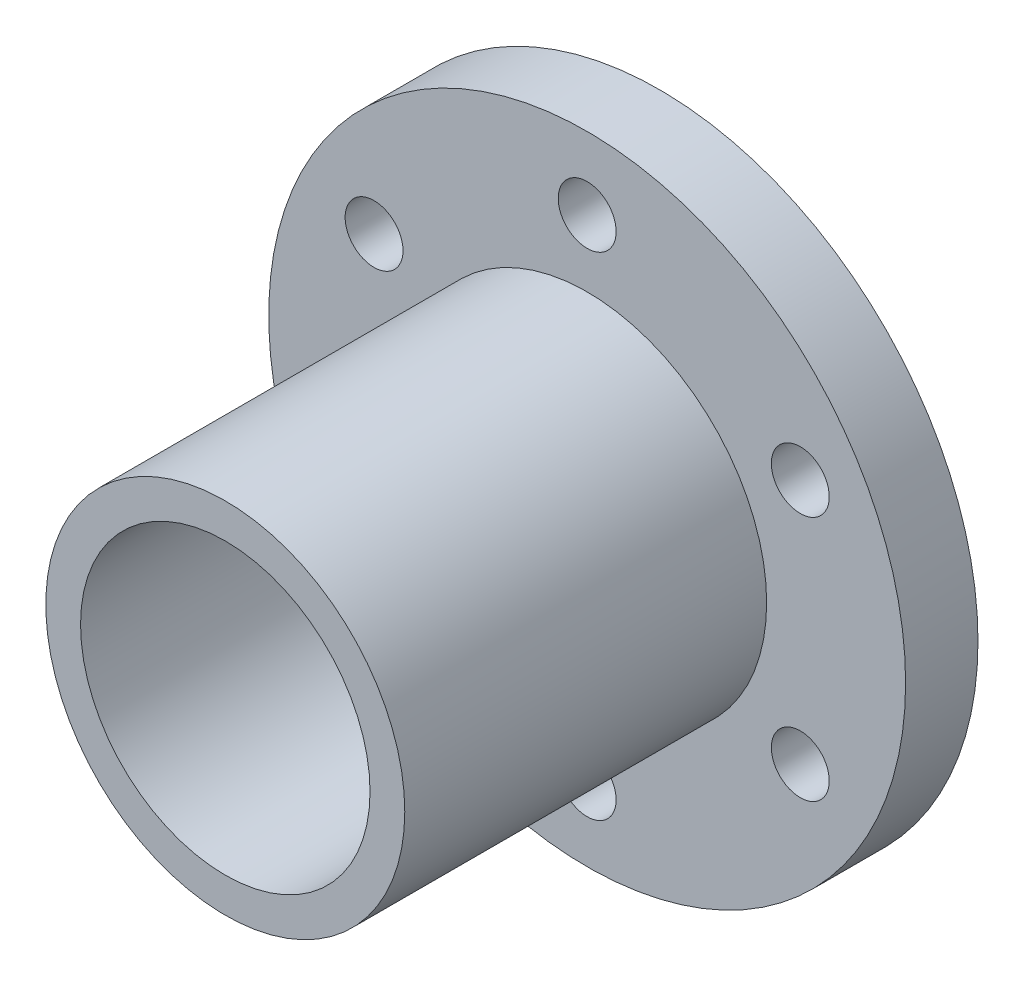
ISO-10303-21;
HEADER;
FILE_DESCRIPTION(('STEP AP214'),'2;1');
FILE_NAME('part.step','',(''),(''),'','','');
FILE_SCHEMA(('AUTOMOTIVE_DESIGN { 1 0 10303 214 1 1 1 1 }'));
ENDSEC;
DATA;
#1=APPLICATION_CONTEXT('core data for automotive mechanical design processes');
#2=APPLICATION_PROTOCOL_DEFINITION('international standard','automotive_design',2000,#1);
#3=PRODUCT_CONTEXT('',#1,'mechanical');
#4=PRODUCT('Part','Part','',(#3));
#5=PRODUCT_RELATED_PRODUCT_CATEGORY('part','',(#4));
#6=PRODUCT_DEFINITION_FORMATION('','',#4);
#7=PRODUCT_DEFINITION_CONTEXT('part definition',#1,'design');
#8=PRODUCT_DEFINITION('design','',#6,#7);
#9=PRODUCT_DEFINITION_SHAPE('','',#8);
#10=(LENGTH_UNIT() NAMED_UNIT(*) SI_UNIT(.MILLI.,.METRE.));
#11=(NAMED_UNIT(*) PLANE_ANGLE_UNIT() SI_UNIT($,.RADIAN.));
#12=(NAMED_UNIT(*) SI_UNIT($,.STERADIAN.) SOLID_ANGLE_UNIT());
#13=UNCERTAINTY_MEASURE_WITH_UNIT(LENGTH_MEASURE(1.E-05),#10,'distance_accuracy_value','');
#14=(GEOMETRIC_REPRESENTATION_CONTEXT(3) GLOBAL_UNCERTAINTY_ASSIGNED_CONTEXT((#13)) GLOBAL_UNIT_ASSIGNED_CONTEXT((#10,
#11,#12)) REPRESENTATION_CONTEXT('',''));
#15=CARTESIAN_POINT('',(0.,0.,0.));
#16=DIRECTION('',(0.,0.,1.));
#17=DIRECTION('',(1.,0.,0.));
#18=AXIS2_PLACEMENT_3D('',#15,#16,#17);
#19=CARTESIAN_POINT('',(0.,0.,25.));
#20=DIRECTION('',(0.,0.,-1.));
#21=DIRECTION('',(-1.,0.,0.));
#22=AXIS2_PLACEMENT_3D('',#19,#20,#21);
#23=CYLINDRICAL_SURFACE('',#22,110.);
#24=CARTESIAN_POINT('',(0.,0.,25.));
#25=DIRECTION('',(0.,0.,1.));
#26=DIRECTION('',(1.,0.,0.));
#27=AXIS2_PLACEMENT_3D('',#24,#25,#26);
#28=CIRCLE('',#27,110.);
#29=CARTESIAN_POINT('',(110.,0.,25.));
#30=VERTEX_POINT('',#29);
#31=EDGE_CURVE('E38',#30,#30,#28,.T.);
#32=ORIENTED_EDGE('',*,*,#31,.F.);
#33=EDGE_LOOP('',(#32));
#34=FACE_BOUND('',#33,.T.);
#35=CARTESIAN_POINT('',(0.,0.,0.));
#36=DIRECTION('',(0.,0.,1.));
#37=DIRECTION('',(1.,0.,0.));
#38=AXIS2_PLACEMENT_3D('',#35,#36,#37);
#39=CIRCLE('',#38,110.);
#40=CARTESIAN_POINT('',(110.,0.,0.));
#41=VERTEX_POINT('',#40);
#42=EDGE_CURVE('E34',#41,#41,#39,.T.);
#43=ORIENTED_EDGE('',*,*,#42,.T.);
#44=EDGE_LOOP('',(#43));
#45=FACE_BOUND('',#44,.T.);
#46=ADVANCED_FACE('F31',(#34,#45),#23,.T.);
#47=CARTESIAN_POINT('',(0.,0.,25.));
#48=DIRECTION('',(0.,0.,1.));
#49=DIRECTION('',(1.,0.,0.));
#50=AXIS2_PLACEMENT_3D('',#47,#48,#49);
#51=PLANE('',#50);
#52=CARTESIAN_POINT('',(73.6121593216827,-42.4999999999969,25.));
#53=DIRECTION('',(0.,0.,1.));
#54=DIRECTION('',(1.,0.,0.));
#55=AXIS2_PLACEMENT_3D('',#52,#53,#54);
#56=CIRCLE('',#55,10.0000000000047);
#57=CARTESIAN_POINT('',(83.6121593216874,-42.4999999999969,25.));
#58=VERTEX_POINT('',#57);
#59=EDGE_CURVE('E72',#58,#58,#56,.T.);
#60=ORIENTED_EDGE('',*,*,#59,.F.);
#61=EDGE_LOOP('',(#60));
#62=FACE_BOUND('',#61,.T.);
#63=CARTESIAN_POINT('',(7.21630741137477E-12,-85.,25.));
#64=DIRECTION('',(0.,0.,1.));
#65=DIRECTION('',(1.,0.,0.));
#66=AXIS2_PLACEMENT_3D('',#63,#64,#65);
#67=CIRCLE('',#66,10.0000000000075);
#68=CARTESIAN_POINT('',(10.0000000000147,-85.,25.));
#69=VERTEX_POINT('',#68);
#70=EDGE_CURVE('E79',#69,#69,#67,.T.);
#71=ORIENTED_EDGE('',*,*,#70,.F.);
#72=EDGE_LOOP('',(#71));
#73=FACE_BOUND('',#72,.T.);
#74=CARTESIAN_POINT('',(-73.6121593216719,-42.5000000000032,25.));
#75=DIRECTION('',(0.,0.,1.));
#76=DIRECTION('',(1.,0.,0.));
#77=AXIS2_PLACEMENT_3D('',#74,#75,#76);
#78=CIRCLE('',#77,10.0000000000069);
#79=CARTESIAN_POINT('',(-63.612159321665,-42.5000000000032,25.));
#80=VERTEX_POINT('',#79);
#81=EDGE_CURVE('E60',#80,#80,#78,.T.);
#82=ORIENTED_EDGE('',*,*,#81,.F.);
#83=EDGE_LOOP('',(#82));
#84=FACE_BOUND('',#83,.T.);
#85=CARTESIAN_POINT('',(0.,85.,25.));
#86=DIRECTION('',(0.,0.,1.));
#87=DIRECTION('',(1.,0.,0.));
#88=AXIS2_PLACEMENT_3D('',#85,#86,#87);
#89=CIRCLE('',#88,10.);
#90=CARTESIAN_POINT('',(10.,85.,25.));
#91=VERTEX_POINT('',#90);
#92=EDGE_CURVE('E67',#91,#91,#89,.T.);
#93=ORIENTED_EDGE('',*,*,#92,.F.);
#94=EDGE_LOOP('',(#93));
#95=FACE_BOUND('',#94,.T.);
#96=CARTESIAN_POINT('',(73.6121593216791,42.5000000000031,25.));
#97=DIRECTION('',(0.,0.,1.));
#98=DIRECTION('',(1.,0.,0.));
#99=AXIS2_PLACEMENT_3D('',#96,#97,#98);
#100=CIRCLE('',#99,10.000000000001);
#101=CARTESIAN_POINT('',(83.6121593216801,42.5000000000031,25.));
#102=VERTEX_POINT('',#101);
#103=EDGE_CURVE('E84',#102,#102,#100,.T.);
#104=ORIENTED_EDGE('',*,*,#103,.F.);
#105=EDGE_LOOP('',(#104));
#106=FACE_BOUND('',#105,.T.);
#107=CARTESIAN_POINT('',(-73.6121593216755,42.4999999999968,25.));
#108=DIRECTION('',(0.,0.,1.));
#109=DIRECTION('',(1.,0.,0.));
#110=AXIS2_PLACEMENT_3D('',#107,#108,#109);
#111=CIRCLE('',#110,10.0000000000036);
#112=CARTESIAN_POINT('',(-63.6121593216719,42.4999999999968,25.));
#113=VERTEX_POINT('',#112);
#114=EDGE_CURVE('E54',#113,#113,#111,.T.);
#115=ORIENTED_EDGE('',*,*,#114,.F.);
#116=EDGE_LOOP('',(#115));
#117=FACE_BOUND('',#116,.T.);
#118=CARTESIAN_POINT('',(0.,0.,25.));
#119=DIRECTION('',(0.,0.,1.));
#120=DIRECTION('',(1.,0.,0.));
#121=AXIS2_PLACEMENT_3D('',#118,#119,#120);
#122=CIRCLE('',#121,62.);
#123=CARTESIAN_POINT('',(62.,0.,25.));
#124=VERTEX_POINT('',#123);
#125=EDGE_CURVE('E10',#124,#124,#122,.T.);
#126=ORIENTED_EDGE('',*,*,#125,.F.);
#127=EDGE_LOOP('',(#126));
#128=FACE_BOUND('',#127,.T.);
#129=ORIENTED_EDGE('',*,*,#31,.T.);
#130=EDGE_LOOP('',(#129));
#131=FACE_BOUND('',#130,.T.);
#132=ADVANCED_FACE('F101',(#62,#73,#84,#95,#106,#117,#128,#131),#51,.T.);
#133=CARTESIAN_POINT('',(0.,0.,0.));
#134=DIRECTION('',(0.,0.,1.));
#135=DIRECTION('',(1.,0.,0.));
#136=AXIS2_PLACEMENT_3D('',#133,#134,#135);
#137=PLANE('',#136);
#138=CARTESIAN_POINT('',(73.6121593216827,-42.4999999999969,0.));
#139=DIRECTION('',(0.,0.,1.));
#140=DIRECTION('',(1.,0.,0.));
#141=AXIS2_PLACEMENT_3D('',#138,#139,#140);
#142=CIRCLE('',#141,10.0000000000047);
#143=CARTESIAN_POINT('',(83.6121593216874,-42.4999999999969,0.));
#144=VERTEX_POINT('',#143);
#145=EDGE_CURVE('E75',#144,#144,#142,.T.);
#146=ORIENTED_EDGE('',*,*,#145,.T.);
#147=EDGE_LOOP('',(#146));
#148=FACE_BOUND('',#147,.T.);
#149=CARTESIAN_POINT('',(7.21630741137477E-12,-85.,0.));
#150=DIRECTION('',(0.,0.,1.));
#151=DIRECTION('',(1.,0.,0.));
#152=AXIS2_PLACEMENT_3D('',#149,#150,#151);
#153=CIRCLE('',#152,10.0000000000075);
#154=CARTESIAN_POINT('',(10.0000000000147,-85.,0.));
#155=VERTEX_POINT('',#154);
#156=EDGE_CURVE('E64',#155,#155,#153,.T.);
#157=ORIENTED_EDGE('',*,*,#156,.T.);
#158=EDGE_LOOP('',(#157));
#159=FACE_BOUND('',#158,.T.);
#160=CARTESIAN_POINT('',(-73.6121593216719,-42.5000000000032,0.));
#161=DIRECTION('',(0.,0.,1.));
#162=DIRECTION('',(1.,0.,0.));
#163=AXIS2_PLACEMENT_3D('',#160,#161,#162);
#164=CIRCLE('',#163,10.0000000000069);
#165=CARTESIAN_POINT('',(-63.612159321665,-42.5000000000032,0.));
#166=VERTEX_POINT('',#165);
#167=EDGE_CURVE('E63',#166,#166,#164,.T.);
#168=ORIENTED_EDGE('',*,*,#167,.T.);
#169=EDGE_LOOP('',(#168));
#170=FACE_BOUND('',#169,.T.);
#171=CARTESIAN_POINT('',(0.,85.,0.));
#172=DIRECTION('',(0.,0.,1.));
#173=DIRECTION('',(1.,0.,0.));
#174=AXIS2_PLACEMENT_3D('',#171,#172,#173);
#175=CIRCLE('',#174,10.);
#176=CARTESIAN_POINT('',(10.,85.,0.));
#177=VERTEX_POINT('',#176);
#178=EDGE_CURVE('E57',#177,#177,#175,.T.);
#179=ORIENTED_EDGE('',*,*,#178,.T.);
#180=EDGE_LOOP('',(#179));
#181=FACE_BOUND('',#180,.T.);
#182=CARTESIAN_POINT('',(73.6121593216791,42.5000000000031,0.));
#183=DIRECTION('',(0.,0.,1.));
#184=DIRECTION('',(1.,0.,0.));
#185=AXIS2_PLACEMENT_3D('',#182,#183,#184);
#186=CIRCLE('',#185,10.000000000001);
#187=CARTESIAN_POINT('',(83.6121593216801,42.5000000000031,0.));
#188=VERTEX_POINT('',#187);
#189=EDGE_CURVE('E76',#188,#188,#186,.T.);
#190=ORIENTED_EDGE('',*,*,#189,.T.);
#191=EDGE_LOOP('',(#190));
#192=FACE_BOUND('',#191,.T.);
#193=CARTESIAN_POINT('',(-73.6121593216755,42.4999999999968,0.));
#194=DIRECTION('',(0.,0.,1.));
#195=DIRECTION('',(1.,0.,0.));
#196=AXIS2_PLACEMENT_3D('',#193,#194,#195);
#197=CIRCLE('',#196,10.0000000000036);
#198=CARTESIAN_POINT('',(-63.6121593216719,42.4999999999968,0.));
#199=VERTEX_POINT('',#198);
#200=EDGE_CURVE('E51',#199,#199,#197,.T.);
#201=ORIENTED_EDGE('',*,*,#200,.T.);
#202=EDGE_LOOP('',(#201));
#203=FACE_BOUND('',#202,.T.);
#204=CARTESIAN_POINT('',(0.,0.,0.));
#205=DIRECTION('',(0.,0.,1.));
#206=DIRECTION('',(1.,0.,0.));
#207=AXIS2_PLACEMENT_3D('',#204,#205,#206);
#208=CIRCLE('',#207,50.);
#209=CARTESIAN_POINT('',(50.,0.,0.));
#210=VERTEX_POINT('',#209);
#211=EDGE_CURVE('E47',#210,#210,#208,.T.);
#212=ORIENTED_EDGE('',*,*,#211,.T.);
#213=EDGE_LOOP('',(#212));
#214=FACE_BOUND('',#213,.T.);
#215=ORIENTED_EDGE('',*,*,#42,.F.);
#216=EDGE_LOOP('',(#215));
#217=FACE_BOUND('',#216,.T.);
#218=ADVANCED_FACE('F90',(#148,#159,#170,#181,#192,#203,#214,#217),#137,.F.);
#219=CARTESIAN_POINT('',(0.,0.,150.));
#220=DIRECTION('',(0.,0.,-1.));
#221=DIRECTION('',(-1.,0.,0.));
#222=AXIS2_PLACEMENT_3D('',#219,#220,#221);
#223=CYLINDRICAL_SURFACE('',#222,62.);
#224=CARTESIAN_POINT('',(0.,0.,150.));
#225=DIRECTION('',(0.,0.,1.));
#226=DIRECTION('',(1.,0.,0.));
#227=AXIS2_PLACEMENT_3D('',#224,#225,#226);
#228=CIRCLE('',#227,62.);
#229=CARTESIAN_POINT('',(62.,0.,150.));
#230=VERTEX_POINT('',#229);
#231=EDGE_CURVE('E44',#230,#230,#228,.T.);
#232=ORIENTED_EDGE('',*,*,#231,.F.);
#233=EDGE_LOOP('',(#232));
#234=FACE_BOUND('',#233,.T.);
#235=ORIENTED_EDGE('',*,*,#125,.T.);
#236=EDGE_LOOP('',(#235));
#237=FACE_BOUND('',#236,.T.);
#238=ADVANCED_FACE('F117',(#234,#237),#223,.T.);
#239=CARTESIAN_POINT('',(0.,0.,150.));
#240=DIRECTION('',(0.,0.,1.));
#241=DIRECTION('',(1.,0.,0.));
#242=AXIS2_PLACEMENT_3D('',#239,#240,#241);
#243=PLANE('',#242);
#244=CARTESIAN_POINT('',(0.,0.,150.));
#245=DIRECTION('',(0.,0.,1.));
#246=DIRECTION('',(1.,0.,0.));
#247=AXIS2_PLACEMENT_3D('',#244,#245,#246);
#248=CIRCLE('',#247,50.);
#249=CARTESIAN_POINT('',(50.,0.,150.));
#250=VERTEX_POINT('',#249);
#251=EDGE_CURVE('E48',#250,#250,#248,.T.);
#252=ORIENTED_EDGE('',*,*,#251,.F.);
#253=EDGE_LOOP('',(#252));
#254=FACE_BOUND('',#253,.T.);
#255=ORIENTED_EDGE('',*,*,#231,.T.);
#256=EDGE_LOOP('',(#255));
#257=FACE_BOUND('',#256,.T.);
#258=ADVANCED_FACE('F122',(#254,#257),#243,.T.);
#259=CARTESIAN_POINT('',(0.,0.,0.));
#260=DIRECTION('',(0.,0.,1.));
#261=DIRECTION('',(1.,0.,0.));
#262=AXIS2_PLACEMENT_3D('',#259,#260,#261);
#263=CYLINDRICAL_SURFACE('',#262,50.);
#264=ORIENTED_EDGE('',*,*,#211,.F.);
#265=EDGE_LOOP('',(#264));
#266=FACE_BOUND('',#265,.T.);
#267=ORIENTED_EDGE('',*,*,#251,.T.);
#268=EDGE_LOOP('',(#267));
#269=FACE_BOUND('',#268,.T.);
#270=ADVANCED_FACE('F129',(#266,#269),#263,.F.);
#271=CARTESIAN_POINT('',(-73.6121593216755,42.4999999999968,0.));
#272=DIRECTION('',(0.,0.,1.));
#273=DIRECTION('',(1.,0.,0.));
#274=AXIS2_PLACEMENT_3D('',#271,#272,#273);
#275=CYLINDRICAL_SURFACE('',#274,10.0000000000036);
#276=ORIENTED_EDGE('',*,*,#200,.F.);
#277=EDGE_LOOP('',(#276));
#278=FACE_BOUND('',#277,.T.);
#279=ORIENTED_EDGE('',*,*,#114,.T.);
#280=EDGE_LOOP('',(#279));
#281=FACE_BOUND('',#280,.T.);
#282=ADVANCED_FACE('F97',(#278,#281),#275,.F.);
#283=CARTESIAN_POINT('',(73.6121593216791,42.5000000000031,0.));
#284=DIRECTION('',(0.,0.,1.));
#285=DIRECTION('',(1.,0.,0.));
#286=AXIS2_PLACEMENT_3D('',#283,#284,#285);
#287=CYLINDRICAL_SURFACE('',#286,10.000000000001);
#288=ORIENTED_EDGE('',*,*,#189,.F.);
#289=EDGE_LOOP('',(#288));
#290=FACE_BOUND('',#289,.T.);
#291=ORIENTED_EDGE('',*,*,#103,.T.);
#292=EDGE_LOOP('',(#291));
#293=FACE_BOUND('',#292,.T.);
#294=ADVANCED_FACE('F93',(#290,#293),#287,.F.);
#295=CARTESIAN_POINT('',(0.,85.,0.));
#296=DIRECTION('',(0.,0.,1.));
#297=DIRECTION('',(1.,0.,0.));
#298=AXIS2_PLACEMENT_3D('',#295,#296,#297);
#299=CYLINDRICAL_SURFACE('',#298,10.);
#300=ORIENTED_EDGE('',*,*,#178,.F.);
#301=EDGE_LOOP('',(#300));
#302=FACE_BOUND('',#301,.T.);
#303=ORIENTED_EDGE('',*,*,#92,.T.);
#304=EDGE_LOOP('',(#303));
#305=FACE_BOUND('',#304,.T.);
#306=ADVANCED_FACE('F96',(#302,#305),#299,.F.);
#307=CARTESIAN_POINT('',(-73.6121593216719,-42.5000000000032,0.));
#308=DIRECTION('',(0.,0.,1.));
#309=DIRECTION('',(1.,0.,0.));
#310=AXIS2_PLACEMENT_3D('',#307,#308,#309);
#311=CYLINDRICAL_SURFACE('',#310,10.0000000000069);
#312=ORIENTED_EDGE('',*,*,#167,.F.);
#313=EDGE_LOOP('',(#312));
#314=FACE_BOUND('',#313,.T.);
#315=ORIENTED_EDGE('',*,*,#81,.T.);
#316=EDGE_LOOP('',(#315));
#317=FACE_BOUND('',#316,.T.);
#318=ADVANCED_FACE('F137',(#314,#317),#311,.F.);
#319=CARTESIAN_POINT('',(7.21630741137477E-12,-85.,0.));
#320=DIRECTION('',(0.,0.,1.));
#321=DIRECTION('',(1.,0.,0.));
#322=AXIS2_PLACEMENT_3D('',#319,#320,#321);
#323=CYLINDRICAL_SURFACE('',#322,10.0000000000075);
#324=ORIENTED_EDGE('',*,*,#156,.F.);
#325=EDGE_LOOP('',(#324));
#326=FACE_BOUND('',#325,.T.);
#327=ORIENTED_EDGE('',*,*,#70,.T.);
#328=EDGE_LOOP('',(#327));
#329=FACE_BOUND('',#328,.T.);
#330=ADVANCED_FACE('F140',(#326,#329),#323,.F.);
#331=CARTESIAN_POINT('',(73.6121593216827,-42.4999999999969,0.));
#332=DIRECTION('',(0.,0.,1.));
#333=DIRECTION('',(1.,0.,0.));
#334=AXIS2_PLACEMENT_3D('',#331,#332,#333);
#335=CYLINDRICAL_SURFACE('',#334,10.0000000000047);
#336=ORIENTED_EDGE('',*,*,#145,.F.);
#337=EDGE_LOOP('',(#336));
#338=FACE_BOUND('',#337,.T.);
#339=ORIENTED_EDGE('',*,*,#59,.T.);
#340=EDGE_LOOP('',(#339));
#341=FACE_BOUND('',#340,.T.);
#342=ADVANCED_FACE('F145',(#338,#341),#335,.F.);
#343=CLOSED_SHELL('',(#46,#132,#218,#238,#258,#270,#282,#294,#306,#318,#330,#342));
#344=MANIFOLD_SOLID_BREP('B2',#343);
#345=ADVANCED_BREP_SHAPE_REPRESENTATION('',(#18,#344),#14);
#346=SHAPE_DEFINITION_REPRESENTATION(#9,#345);
ENDSEC;
END-ISO-10303-21;
